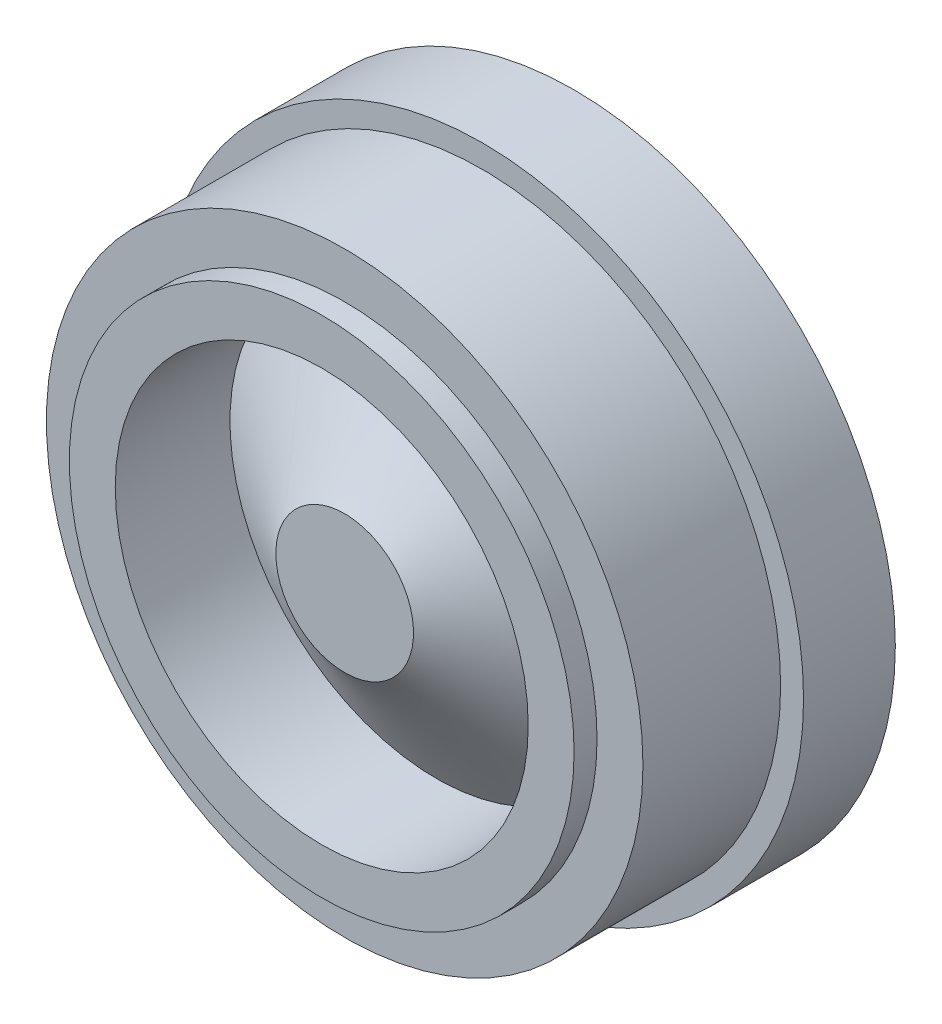
ISO-10303-21;
HEADER;
FILE_DESCRIPTION(('STEP AP214'),'2;1');
FILE_NAME('part.step','',(''),(''),'','','');
FILE_SCHEMA(('AUTOMOTIVE_DESIGN { 1 0 10303 214 1 1 1 1 }'));
ENDSEC;
DATA;
#1=APPLICATION_CONTEXT('core data for automotive mechanical design processes');
#2=APPLICATION_PROTOCOL_DEFINITION('international standard','automotive_design',2000,#1);
#3=PRODUCT_CONTEXT('',#1,'mechanical');
#4=PRODUCT('Part','Part','',(#3));
#5=PRODUCT_RELATED_PRODUCT_CATEGORY('part','',(#4));
#6=PRODUCT_DEFINITION_FORMATION('','',#4);
#7=PRODUCT_DEFINITION_CONTEXT('part definition',#1,'design');
#8=PRODUCT_DEFINITION('design','',#6,#7);
#9=PRODUCT_DEFINITION_SHAPE('','',#8);
#10=(LENGTH_UNIT() NAMED_UNIT(*) SI_UNIT(.MILLI.,.METRE.));
#11=(NAMED_UNIT(*) PLANE_ANGLE_UNIT() SI_UNIT($,.RADIAN.));
#12=(NAMED_UNIT(*) SI_UNIT($,.STERADIAN.) SOLID_ANGLE_UNIT());
#13=UNCERTAINTY_MEASURE_WITH_UNIT(LENGTH_MEASURE(1.E-05),#10,'distance_accuracy_value','');
#14=(GEOMETRIC_REPRESENTATION_CONTEXT(3) GLOBAL_UNCERTAINTY_ASSIGNED_CONTEXT((#13)) GLOBAL_UNIT_ASSIGNED_CONTEXT((#10,
#11,#12)) REPRESENTATION_CONTEXT('',''));
#15=CARTESIAN_POINT('',(0.,0.,0.));
#16=DIRECTION('',(0.,0.,1.));
#17=DIRECTION('',(1.,0.,0.));
#18=AXIS2_PLACEMENT_3D('',#15,#16,#17);
#19=CARTESIAN_POINT('',(0.,0.,4.));
#20=DIRECTION('',(0.,0.,1.));
#21=DIRECTION('',(1.,0.,0.));
#22=AXIS2_PLACEMENT_3D('',#19,#20,#21);
#23=CYLINDRICAL_SURFACE('',#22,13.);
#24=CARTESIAN_POINT('',(0.,0.,4.));
#25=DIRECTION('',(0.,0.,1.));
#26=DIRECTION('',(1.,0.,0.));
#27=AXIS2_PLACEMENT_3D('',#24,#25,#26);
#28=CIRCLE('',#27,13.);
#29=CARTESIAN_POINT('',(13.,0.,4.));
#30=VERTEX_POINT('',#29);
#31=EDGE_CURVE('E54',#30,#30,#28,.T.);
#32=ORIENTED_EDGE('',*,*,#31,.T.);
#33=EDGE_LOOP('',(#32));
#34=FACE_BOUND('',#33,.T.);
#35=CARTESIAN_POINT('',(0.,0.,10.));
#36=DIRECTION('',(0.,0.,1.));
#37=DIRECTION('',(1.,0.,0.));
#38=AXIS2_PLACEMENT_3D('',#35,#36,#37);
#39=CIRCLE('',#38,13.);
#40=CARTESIAN_POINT('',(13.,0.,10.));
#41=VERTEX_POINT('',#40);
#42=EDGE_CURVE('E77',#41,#41,#39,.T.);
#43=ORIENTED_EDGE('',*,*,#42,.F.);
#44=EDGE_LOOP('',(#43));
#45=FACE_BOUND('',#44,.T.);
#46=ADVANCED_FACE('F41',(#34,#45),#23,.T.);
#47=CARTESIAN_POINT('',(0.,0.,11.));
#48=DIRECTION('',(0.,0.,-1.));
#49=DIRECTION('',(-1.,0.,0.));
#50=AXIS2_PLACEMENT_3D('',#47,#48,#49);
#51=CYLINDRICAL_SURFACE('',#50,14.);
#52=CARTESIAN_POINT('',(0.,0.,0.));
#53=DIRECTION('',(0.,0.,1.));
#54=DIRECTION('',(1.,0.,0.));
#55=AXIS2_PLACEMENT_3D('',#52,#53,#54);
#56=CIRCLE('',#55,14.);
#57=CARTESIAN_POINT('',(14.,0.,0.));
#58=VERTEX_POINT('',#57);
#59=EDGE_CURVE('E11',#58,#58,#56,.T.);
#60=ORIENTED_EDGE('',*,*,#59,.T.);
#61=EDGE_LOOP('',(#60));
#62=FACE_BOUND('',#61,.T.);
#63=CARTESIAN_POINT('',(0.,0.,4.));
#64=DIRECTION('',(0.,0.,1.));
#65=DIRECTION('',(1.,0.,0.));
#66=AXIS2_PLACEMENT_3D('',#63,#64,#65);
#67=CIRCLE('',#66,14.);
#68=CARTESIAN_POINT('',(14.,0.,4.));
#69=VERTEX_POINT('',#68);
#70=EDGE_CURVE('E49',#69,#69,#67,.T.);
#71=ORIENTED_EDGE('',*,*,#70,.F.);
#72=EDGE_LOOP('',(#71));
#73=FACE_BOUND('',#72,.T.);
#74=ADVANCED_FACE('F43',(#62,#73),#51,.T.);
#75=CARTESIAN_POINT('',(0.,0.,0.));
#76=DIRECTION('',(0.,0.,1.));
#77=DIRECTION('',(1.,0.,0.));
#78=AXIS2_PLACEMENT_3D('',#75,#76,#77);
#79=PLANE('',#78);
#80=CARTESIAN_POINT('',(0.,0.,0.));
#81=DIRECTION('',(0.,0.,-1.));
#82=DIRECTION('',(-1.,0.,0.));
#83=AXIS2_PLACEMENT_3D('',#80,#81,#82);
#84=CIRCLE('',#83,5.);
#85=CARTESIAN_POINT('',(-5.,0.,0.));
#86=VERTEX_POINT('',#85);
#87=EDGE_CURVE('E72',#86,#86,#84,.T.);
#88=ORIENTED_EDGE('',*,*,#87,.F.);
#89=EDGE_LOOP('',(#88));
#90=FACE_BOUND('',#89,.T.);
#91=ORIENTED_EDGE('',*,*,#59,.F.);
#92=EDGE_LOOP('',(#91));
#93=FACE_BOUND('',#92,.T.);
#94=ADVANCED_FACE('F89',(#90,#93),#79,.F.);
#95=CARTESIAN_POINT('',(0.,0.,4.));
#96=DIRECTION('',(0.,0.,1.));
#97=DIRECTION('',(1.,0.,0.));
#98=AXIS2_PLACEMENT_3D('',#95,#96,#97);
#99=PLANE('',#98);
#100=ORIENTED_EDGE('',*,*,#31,.F.);
#101=EDGE_LOOP('',(#100));
#102=FACE_BOUND('',#101,.T.);
#103=ORIENTED_EDGE('',*,*,#70,.T.);
#104=EDGE_LOOP('',(#103));
#105=FACE_BOUND('',#104,.T.);
#106=ADVANCED_FACE('F85',(#102,#105),#99,.T.);
#107=CARTESIAN_POINT('',(0.,0.,10.));
#108=DIRECTION('',(0.,0.,1.));
#109=DIRECTION('',(1.,0.,0.));
#110=AXIS2_PLACEMENT_3D('',#107,#108,#109);
#111=PLANE('',#110);
#112=CARTESIAN_POINT('',(0.,0.,10.));
#113=DIRECTION('',(0.,0.,1.));
#114=DIRECTION('',(1.,0.,0.));
#115=AXIS2_PLACEMENT_3D('',#112,#113,#114);
#116=CIRCLE('',#115,11.);
#117=CARTESIAN_POINT('',(11.,0.,10.));
#118=VERTEX_POINT('',#117);
#119=EDGE_CURVE('E64',#118,#118,#116,.T.);
#120=ORIENTED_EDGE('',*,*,#119,.F.);
#121=EDGE_LOOP('',(#120));
#122=FACE_BOUND('',#121,.T.);
#123=ORIENTED_EDGE('',*,*,#42,.T.);
#124=EDGE_LOOP('',(#123));
#125=FACE_BOUND('',#124,.T.);
#126=ADVANCED_FACE('F88',(#122,#125),#111,.T.);
#127=CARTESIAN_POINT('',(0.,0.,10.));
#128=DIRECTION('',(0.,0.,1.));
#129=DIRECTION('',(1.,0.,0.));
#130=AXIS2_PLACEMENT_3D('',#127,#128,#129);
#131=CYLINDRICAL_SURFACE('',#130,11.);
#132=ORIENTED_EDGE('',*,*,#119,.T.);
#133=EDGE_LOOP('',(#132));
#134=FACE_BOUND('',#133,.T.);
#135=CARTESIAN_POINT('',(0.,0.,11.));
#136=DIRECTION('',(0.,0.,1.));
#137=DIRECTION('',(1.,0.,0.));
#138=AXIS2_PLACEMENT_3D('',#135,#136,#137);
#139=CIRCLE('',#138,11.);
#140=CARTESIAN_POINT('',(11.,0.,11.));
#141=VERTEX_POINT('',#140);
#142=EDGE_CURVE('E59',#141,#141,#139,.T.);
#143=ORIENTED_EDGE('',*,*,#142,.F.);
#144=EDGE_LOOP('',(#143));
#145=FACE_BOUND('',#144,.T.);
#146=ADVANCED_FACE('F109',(#134,#145),#131,.T.);
#147=CARTESIAN_POINT('',(0.,0.,11.));
#148=DIRECTION('',(0.,0.,1.));
#149=DIRECTION('',(1.,0.,0.));
#150=AXIS2_PLACEMENT_3D('',#147,#148,#149);
#151=PLANE('',#150);
#152=CARTESIAN_POINT('',(0.,0.,11.));
#153=DIRECTION('',(0.,0.,1.));
#154=DIRECTION('',(1.,0.,0.));
#155=AXIS2_PLACEMENT_3D('',#152,#153,#154);
#156=CIRCLE('',#155,9.);
#157=CARTESIAN_POINT('',(9.,0.,11.));
#158=VERTEX_POINT('',#157);
#159=EDGE_CURVE('E60',#158,#158,#156,.T.);
#160=ORIENTED_EDGE('',*,*,#159,.F.);
#161=EDGE_LOOP('',(#160));
#162=FACE_BOUND('',#161,.T.);
#163=ORIENTED_EDGE('',*,*,#142,.T.);
#164=EDGE_LOOP('',(#163));
#165=FACE_BOUND('',#164,.T.);
#166=ADVANCED_FACE('F106',(#162,#165),#151,.T.);
#167=CARTESIAN_POINT('',(0.,0.,6.));
#168=DIRECTION('',(0.,0.,1.));
#169=DIRECTION('',(1.,0.,0.));
#170=AXIS2_PLACEMENT_3D('',#167,#168,#169);
#171=CYLINDRICAL_SURFACE('',#170,9.);
#172=CARTESIAN_POINT('',(0.,0.,6.));
#173=DIRECTION('',(0.,0.,1.));
#174=DIRECTION('',(1.,0.,0.));
#175=AXIS2_PLACEMENT_3D('',#172,#173,#174);
#176=CIRCLE('',#175,9.);
#177=CARTESIAN_POINT('',(-5.53401892782865,7.09750903531895,6.));
#178=VERTEX_POINT('',#177);
#179=EDGE_CURVE('E57',#178,#178,#176,.T.);
#180=ORIENTED_EDGE('',*,*,#179,.F.);
#181=EDGE_LOOP('',(#180));
#182=FACE_BOUND('',#181,.T.);
#183=ORIENTED_EDGE('',*,*,#159,.T.);
#184=EDGE_LOOP('',(#183));
#185=FACE_BOUND('',#184,.T.);
#186=ADVANCED_FACE('F108',(#182,#185),#171,.F.);
#187=CARTESIAN_POINT('',(0.,0.,5.));
#188=DIRECTION('',(0.,0.,-1.));
#189=DIRECTION('',(-1.,0.,0.));
#190=AXIS2_PLACEMENT_3D('',#187,#188,#189);
#191=CYLINDRICAL_SURFACE('',#190,5.);
#192=CARTESIAN_POINT('',(0.,0.,5.));
#193=DIRECTION('',(0.,0.,-1.));
#194=DIRECTION('',(-1.,0.,0.));
#195=AXIS2_PLACEMENT_3D('',#192,#193,#194);
#196=CIRCLE('',#195,5.);
#197=CARTESIAN_POINT('',(-5.,0.,5.));
#198=VERTEX_POINT('',#197);
#199=EDGE_CURVE('E67',#198,#198,#196,.T.);
#200=ORIENTED_EDGE('',*,*,#199,.F.);
#201=EDGE_LOOP('',(#200));
#202=FACE_BOUND('',#201,.T.);
#203=ORIENTED_EDGE('',*,*,#87,.T.);
#204=EDGE_LOOP('',(#203));
#205=FACE_BOUND('',#204,.T.);
#206=ADVANCED_FACE('F115',(#202,#205),#191,.F.);
#207=CARTESIAN_POINT('',(0.,0.,5.));
#208=DIRECTION('',(0.,0.,-1.));
#209=DIRECTION('',(-1.,0.,0.));
#210=AXIS2_PLACEMENT_3D('',#207,#208,#209);
#211=PLANE('',#210);
#212=ORIENTED_EDGE('',*,*,#199,.T.);
#213=EDGE_LOOP('',(#212));
#214=FACE_BOUND('',#213,.T.);
#215=ADVANCED_FACE('F128',(#214),#211,.T.);
#216=CARTESIAN_POINT('',(0.,0.,10.));
#217=DIRECTION('',(0.,0.,1.));
#218=DIRECTION('',(1.,0.,0.));
#219=AXIS2_PLACEMENT_3D('',#216,#217,#218);
#220=PLANE('',#219);
#221=CARTESIAN_POINT('',(0.,0.,10.));
#222=DIRECTION('',(0.,0.,1.));
#223=DIRECTION('',(1.,0.,0.));
#224=AXIS2_PLACEMENT_3D('',#221,#222,#223);
#225=CIRCLE('',#224,3.);
#226=CARTESIAN_POINT('',(-2.63163962101371,1.44030306016158,10.));
#227=VERTEX_POINT('',#226);
#228=EDGE_CURVE('E161',#227,#227,#225,.T.);
#229=ORIENTED_EDGE('',*,*,#228,.T.);
#230=EDGE_LOOP('',(#229));
#231=FACE_BOUND('',#230,.T.);
#232=ADVANCED_FACE('F132',(#231),#220,.T.);
#233=CARTESIAN_POINT('',(-2.63163962101371,1.44030306016158,10.));
#234=CARTESIAN_POINT('',(-5.53401892782865,7.09750903531895,6.));
#235=CARTESIAN_POINT('',(0.248966499309457,6.703582302189,10.));
#236=CARTESIAN_POINT('',(8.66099914280925,18.1655468909763,6.));
#237=CARTESIAN_POINT('',(5.51224574133688,3.82297618186583,10.));
#238=CARTESIAN_POINT('',(19.7290369984666,3.97052882033835,6.));
#239=CARTESIAN_POINT('',(2.63163962101371,-1.44030306016158,10.));
#240=CARTESIAN_POINT('',(5.53401892782865,-7.09750903531895,6.));
#241=CARTESIAN_POINT('',(-0.248966499309459,-6.70358230218901,10.));
#242=CARTESIAN_POINT('',(-8.66099914280926,-18.1655468909763,6.));
#243=CARTESIAN_POINT('',(-5.51224574133688,-3.82297618186584,10.));
#244=CARTESIAN_POINT('',(-19.7290369984666,-3.97052882033835,6.));
#245=CARTESIAN_POINT('',(-2.63163962101371,1.44030306016158,10.));
#246=CARTESIAN_POINT('',(-5.53401892782865,7.09750903531895,6.));
#247=(BOUNDED_SURFACE() B_SPLINE_SURFACE(3,1,((#233,#234),(#235,#236),(#237,#238),(#239,#240),
(#241,#242),(#243,#244),(#245,#246)),.UNSPECIFIED.,.T.,.F.,.F.) B_SPLINE_SURFACE_WITH_KNOTS((4,
3,4),(2,2),(0.,0.5,1.),(0.,1.),
.UNSPECIFIED.) GEOMETRIC_REPRESENTATION_ITEM() RATIONAL_B_SPLINE_SURFACE(((1.,1.),
(0.333333333333333,0.333333333333333),(0.333333333333333,0.333333333333333),(1.,1.),
(0.333333333333333,0.333333333333333),(0.333333333333333,0.333333333333333),(1.,1.))) REPRESENTATION_ITEM('') SURFACE());
#248=CARTESIAN_POINT('',(-2.63163962101371,1.44030306016158,10.));
#249=CARTESIAN_POINT('',(-2.66187273879303,1.49923228906947,9.95833333333333));
#250=CARTESIAN_POINT('',(-2.69210585657235,1.55816151797736,9.91666666666667));
#251=CARTESIAN_POINT('',(-2.752572092131,1.67601997579314,9.83333333333333));
#252=CARTESIAN_POINT('',(-2.78280520991032,1.73494920470103,9.79166666666667));
#253=CARTESIAN_POINT('',(-2.84327144546897,1.85280766251681,9.70833333333333));
#254=CARTESIAN_POINT('',(-2.87350456324829,1.9117368914247,9.66666666666667));
#255=CARTESIAN_POINT('',(-2.93397079880693,2.02959534924048,9.58333333333333));
#256=CARTESIAN_POINT('',(-2.96420391658625,2.08852457814837,9.54166666666667));
#257=CARTESIAN_POINT('',(-3.0246701521449,2.20638303596414,9.45833333333333));
#258=CARTESIAN_POINT('',(-3.05490326992422,2.26531226487203,9.41666666666667));
#259=CARTESIAN_POINT('',(-3.11536950548287,2.38317072268781,9.33333333333333));
#260=CARTESIAN_POINT('',(-3.14560262326219,2.4420999515957,9.29166666666667));
#261=CARTESIAN_POINT('',(-3.20606885882083,2.55995840941148,9.20833333333333));
#262=CARTESIAN_POINT('',(-3.23630197660016,2.61888763831937,9.16666666666667));
#263=CARTESIAN_POINT('',(-3.2967682121588,2.73674609613515,9.08333333333333));
#264=CARTESIAN_POINT('',(-3.32700132993812,2.79567532504304,9.04166666666667));
#265=CARTESIAN_POINT('',(-3.38746756549677,2.91353378285881,8.95833333333333));
#266=CARTESIAN_POINT('',(-3.41770068327609,2.9724630117667,8.91666666666667));
#267=CARTESIAN_POINT('',(-3.47816691883474,3.09032146958248,8.83333333333333));
#268=CARTESIAN_POINT('',(-3.50840003661406,3.14925069849037,8.79166666666667));
#269=CARTESIAN_POINT('',(-3.5688662721727,3.26710915630615,8.70833333333333));
#270=CARTESIAN_POINT('',(-3.59909938995202,3.32603838521404,8.66666666666667));
#271=CARTESIAN_POINT('',(-3.65956562551067,3.44389684302982,8.58333333333333));
#272=CARTESIAN_POINT('',(-3.68979874328999,3.50282607193771,8.54166666666667));
#273=CARTESIAN_POINT('',(-3.75026497884864,3.62068452975349,8.45833333333333));
#274=CARTESIAN_POINT('',(-3.78049809662796,3.67961375866138,8.41666666666667));
#275=CARTESIAN_POINT('',(-3.8409643321866,3.79747221647715,8.33333333333333));
#276=CARTESIAN_POINT('',(-3.87119744996592,3.85640144538504,8.29166666666667));
#277=CARTESIAN_POINT('',(-3.93166368552457,3.97425990320082,8.20833333333334));
#278=CARTESIAN_POINT('',(-3.96189680330389,4.03318913210871,8.16666666666667));
#279=CARTESIAN_POINT('',(-4.02236303886254,4.15104758992449,8.08333333333334));
#280=CARTESIAN_POINT('',(-4.05259615664186,4.20997681883238,8.04166666666667));
#281=CARTESIAN_POINT('',(-4.1130623922005,4.32783527664816,7.95833333333333));
#282=CARTESIAN_POINT('',(-4.14329550997983,4.38676450555605,7.91666666666667));
#283=CARTESIAN_POINT('',(-4.20376174553847,4.50462296337183,7.83333333333333));
#284=CARTESIAN_POINT('',(-4.23399486331779,4.56355219227972,7.79166666666667));
#285=CARTESIAN_POINT('',(-4.29446109887644,4.68141065009549,7.70833333333334));
#286=CARTESIAN_POINT('',(-4.32469421665576,4.74033987900338,7.66666666666667));
#287=CARTESIAN_POINT('',(-4.3851604522144,4.85819833681916,7.58333333333333));
#288=CARTESIAN_POINT('',(-4.41539356999373,4.91712756572705,7.54166666666667));
#289=CARTESIAN_POINT('',(-4.47585980555237,5.03498602354283,7.45833333333333));
#290=CARTESIAN_POINT('',(-4.50609292333169,5.09391525245072,7.41666666666667));
#291=CARTESIAN_POINT('',(-4.56655915889034,5.2117737102665,7.33333333333333));
#292=CARTESIAN_POINT('',(-4.59679227666966,5.27070293917439,7.29166666666667));
#293=CARTESIAN_POINT('',(-4.65725851222831,5.38856139699016,7.20833333333334));
#294=CARTESIAN_POINT('',(-4.68749163000763,5.44749062589805,7.16666666666667));
#295=CARTESIAN_POINT('',(-4.74795786556627,5.56534908371383,7.08333333333334));
#296=CARTESIAN_POINT('',(-4.7781909833456,5.62427831262172,7.04166666666667));
#297=CARTESIAN_POINT('',(-4.83865721890424,5.7421367704375,6.95833333333334));
#298=CARTESIAN_POINT('',(-4.86889033668356,5.80106599934539,6.91666666666667));
#299=CARTESIAN_POINT('',(-4.92935657224221,5.91892445716117,6.83333333333334));
#300=CARTESIAN_POINT('',(-4.95958969002153,5.97785368606906,6.79166666666667));
#301=CARTESIAN_POINT('',(-5.02005592558017,6.09571214388484,6.70833333333334));
#302=CARTESIAN_POINT('',(-5.0502890433595,6.15464137279272,6.66666666666667));
#303=CARTESIAN_POINT('',(-5.11075527891814,6.2724998306085,6.58333333333334));
#304=CARTESIAN_POINT('',(-5.14098839669746,6.33142905951639,6.54166666666667));
#305=CARTESIAN_POINT('',(-5.20145463225611,6.44928751733217,6.45833333333334));
#306=CARTESIAN_POINT('',(-5.23168775003543,6.50821674624006,6.41666666666667));
#307=CARTESIAN_POINT('',(-5.29215398559407,6.62607520405584,6.33333333333334));
#308=CARTESIAN_POINT('',(-5.3223871033734,6.68500443296373,6.29166666666667));
#309=CARTESIAN_POINT('',(-5.38285333893204,6.80286289077951,6.20833333333334));
#310=CARTESIAN_POINT('',(-5.41308645671137,6.8617921196874,6.16666666666667));
#311=CARTESIAN_POINT('',(-5.47355269227001,6.97965057750317,6.08333333333334));
#312=CARTESIAN_POINT('',(-5.50378581004933,7.03857980641106,6.04166666666667));
#313=CARTESIAN_POINT('',(-5.53401892782865,7.09750903531895,6.));
#314=B_SPLINE_CURVE_WITH_KNOTS('',3,(#248,#249,#250,#251,#252,#253,#254,#255,#256,#257,#258,
#259,#260,#261,#262,#263,#264,#265,#266,#267,#268,#269,#270,#271,#272,#273,#274,#275,#276,#277,
#278,#279,#280,#281,#282,#283,#284,#285,#286,#287,#288,#289,#290,#291,#292,#293,#294,#295,#296,
#297,#298,#299,#300,#301,#302,#303,#304,#305,#306,#307,#308,#309,#310,#311,#312,#313),
.UNSPECIFIED.,.F.,.F.,(4,2,2,2,2,2,2,2,2,2,2,2,2,2,2,2,2,2,2,2,2,2,2,2,2,2,2,2,2,2,2,2,4),(0.,
0.234745093395008,0.469490186790016,0.704235280185025,0.938980373580032,1.17372546697504,
1.40847056037005,1.64321565376506,1.87796074716006,2.11270584055507,2.34745093395008,
2.58219602734509,2.8169411207401,3.05168621413511,3.28643130753011,3.52117640092512,
3.75592149432013,3.99066658771514,4.22541168111015,4.46015677450515,4.69490186790016,
4.92964696129517,5.16439205469018,5.39913714808519,5.63388224148019,5.8686273348752,
6.10337242827021,6.33811752166522,6.57286261506023,6.80760770845524,7.04235280185025,
7.27709789524525,7.51184298864026),.UNSPECIFIED.);
#315=EDGE_CURVE('BSEAM134',#227,#178,#314,.T.);
#316=ORIENTED_EDGE('',*,*,#228,.F.);
#317=ORIENTED_EDGE('',*,*,#179,.T.);
#318=ORIENTED_EDGE('',*,*,#315,.T.);
#319=ORIENTED_EDGE('',*,*,#315,.F.);
#320=EDGE_LOOP('',(#316,#318,#317,#319));
#321=FACE_BOUND('',#320,.T.);
#322=ADVANCED_FACE('F134',(#321),#247,.T.);
#323=CLOSED_SHELL('',(#46,#74,#94,#106,#126,#146,#166,#186,#206,#215,#232,#322));
#324=MANIFOLD_SOLID_BREP('B2',#323);
#325=ADVANCED_BREP_SHAPE_REPRESENTATION('',(#18,#324),#14);
#326=SHAPE_DEFINITION_REPRESENTATION(#9,#325);
ENDSEC;
END-ISO-10303-21;
